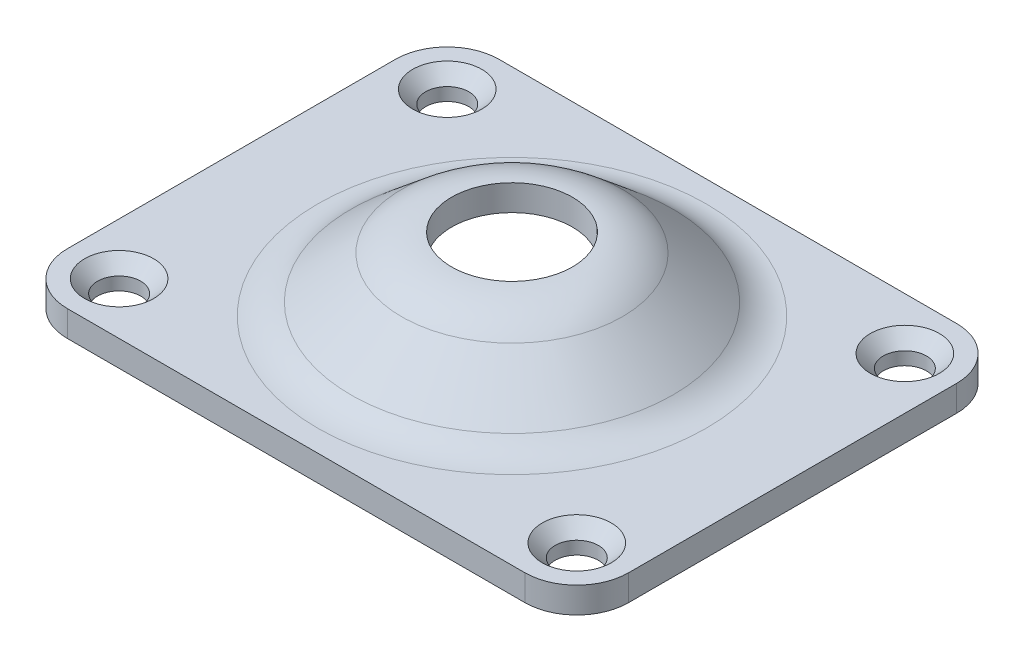
ISO-10303-21;
HEADER;
FILE_DESCRIPTION(('STEP AP214'),'2;1');
FILE_NAME('part.step','',(''),(''),'','','');
FILE_SCHEMA(('AUTOMOTIVE_DESIGN { 1 0 10303 214 1 1 1 1 }'));
ENDSEC;
DATA;
#1=APPLICATION_CONTEXT('core data for automotive mechanical design processes');
#2=APPLICATION_PROTOCOL_DEFINITION('international standard','automotive_design',2000,#1);
#3=PRODUCT_CONTEXT('',#1,'mechanical');
#4=PRODUCT('Part','Part','',(#3));
#5=PRODUCT_RELATED_PRODUCT_CATEGORY('part','',(#4));
#6=PRODUCT_DEFINITION_FORMATION('','',#4);
#7=PRODUCT_DEFINITION_CONTEXT('part definition',#1,'design');
#8=PRODUCT_DEFINITION('design','',#6,#7);
#9=PRODUCT_DEFINITION_SHAPE('','',#8);
#10=(LENGTH_UNIT() NAMED_UNIT(*) SI_UNIT(.MILLI.,.METRE.));
#11=(NAMED_UNIT(*) PLANE_ANGLE_UNIT() SI_UNIT($,.RADIAN.));
#12=(NAMED_UNIT(*) SI_UNIT($,.STERADIAN.) SOLID_ANGLE_UNIT());
#13=UNCERTAINTY_MEASURE_WITH_UNIT(LENGTH_MEASURE(1.E-05),#10,'distance_accuracy_value','');
#14=(GEOMETRIC_REPRESENTATION_CONTEXT(3) GLOBAL_UNCERTAINTY_ASSIGNED_CONTEXT((#13)) GLOBAL_UNIT_ASSIGNED_CONTEXT((#10,
#11,#12)) REPRESENTATION_CONTEXT('',''));
#15=CARTESIAN_POINT('',(0.,0.,0.));
#16=DIRECTION('',(0.,0.,1.));
#17=DIRECTION('',(1.,0.,0.));
#18=AXIS2_PLACEMENT_3D('',#15,#16,#17);
#19=CARTESIAN_POINT('',(-26.5,3.,19.));
#20=DIRECTION('',(0.,-1.,0.));
#21=DIRECTION('',(0.,0.,-1.));
#22=AXIS2_PLACEMENT_3D('',#19,#20,#21);
#23=PLANE('',#22);
#24=CARTESIAN_POINT('',(26.5,3.,19.));
#25=DIRECTION('',(0.,-1.,0.));
#26=DIRECTION('',(0.,0.,-1.));
#27=AXIS2_PLACEMENT_3D('',#24,#25,#26);
#28=CIRCLE('',#27,3.99999999999999);
#29=CARTESIAN_POINT('',(26.5,3.,23.));
#30=VERTEX_POINT('',#29);
#31=EDGE_CURVE('E184',#30,#30,#28,.T.);
#32=ORIENTED_EDGE('',*,*,#31,.T.);
#33=EDGE_LOOP('',(#32));
#34=FACE_BOUND('',#33,.T.);
#35=CARTESIAN_POINT('',(26.5,3.,-19.));
#36=DIRECTION('',(0.,-1.,0.));
#37=DIRECTION('',(0.,0.,-1.));
#38=AXIS2_PLACEMENT_3D('',#35,#36,#37);
#39=CIRCLE('',#38,3.99999999999999);
#40=CARTESIAN_POINT('',(26.5,3.,-15.));
#41=VERTEX_POINT('',#40);
#42=EDGE_CURVE('E181',#41,#41,#39,.T.);
#43=ORIENTED_EDGE('',*,*,#42,.T.);
#44=EDGE_LOOP('',(#43));
#45=FACE_BOUND('',#44,.T.);
#46=CARTESIAN_POINT('',(-26.5,3.,-19.));
#47=DIRECTION('',(0.,-1.,0.));
#48=DIRECTION('',(0.,0.,-1.));
#49=AXIS2_PLACEMENT_3D('',#46,#47,#48);
#50=CIRCLE('',#49,3.99999999999999);
#51=CARTESIAN_POINT('',(-26.5,3.,-15.));
#52=VERTEX_POINT('',#51);
#53=EDGE_CURVE('E178',#52,#52,#50,.T.);
#54=ORIENTED_EDGE('',*,*,#53,.T.);
#55=EDGE_LOOP('',(#54));
#56=FACE_BOUND('',#55,.T.);
#57=CARTESIAN_POINT('',(-26.5,3.,19.));
#58=DIRECTION('',(0.,-1.,0.));
#59=DIRECTION('',(0.,0.,-1.));
#60=AXIS2_PLACEMENT_3D('',#57,#58,#59);
#61=CIRCLE('',#60,3.99999999999999);
#62=CARTESIAN_POINT('',(-26.5,3.,23.));
#63=VERTEX_POINT('',#62);
#64=EDGE_CURVE('E175',#63,#63,#61,.T.);
#65=ORIENTED_EDGE('',*,*,#64,.T.);
#66=EDGE_LOOP('',(#65));
#67=FACE_BOUND('',#66,.T.);
#68=CARTESIAN_POINT('',(-26.5,3.,19.));
#69=DIRECTION('',(0.,1.,0.));
#70=DIRECTION('',(0.,0.,-1.));
#71=AXIS2_PLACEMENT_3D('',#68,#69,#70);
#72=CIRCLE('',#71,6.);
#73=CARTESIAN_POINT('',(-32.5,3.,19.));
#74=VERTEX_POINT('',#73);
#75=CARTESIAN_POINT('',(-26.5,3.,25.));
#76=VERTEX_POINT('',#75);
#77=EDGE_CURVE('E157',#74,#76,#72,.T.);
#78=ORIENTED_EDGE('',*,*,#77,.T.);
#79=DIRECTION('',(1.,0.,0.));
#80=VECTOR('',#79,1.);
#81=CARTESIAN_POINT('',(-26.5,3.,25.));
#82=LINE('',#81,#80);
#83=CARTESIAN_POINT('',(26.5,3.,25.));
#84=VERTEX_POINT('',#83);
#85=EDGE_CURVE('E105',#76,#84,#82,.T.);
#86=ORIENTED_EDGE('',*,*,#85,.T.);
#87=CARTESIAN_POINT('',(26.5,3.,19.));
#88=DIRECTION('',(0.,1.,0.));
#89=DIRECTION('',(0.,0.,1.));
#90=AXIS2_PLACEMENT_3D('',#87,#88,#89);
#91=CIRCLE('',#90,6.);
#92=CARTESIAN_POINT('',(32.5,3.,19.));
#93=VERTEX_POINT('',#92);
#94=EDGE_CURVE('E297',#84,#93,#91,.T.);
#95=ORIENTED_EDGE('',*,*,#94,.T.);
#96=DIRECTION('',(0.,0.,-1.));
#97=VECTOR('',#96,1.);
#98=CARTESIAN_POINT('',(32.5,3.,19.));
#99=LINE('',#98,#97);
#100=CARTESIAN_POINT('',(32.5,3.,-19.));
#101=VERTEX_POINT('',#100);
#102=EDGE_CURVE('E299',#93,#101,#99,.T.);
#103=ORIENTED_EDGE('',*,*,#102,.T.);
#104=CARTESIAN_POINT('',(26.5,3.,-19.));
#105=DIRECTION('',(0.,1.,0.));
#106=DIRECTION('',(0.,0.,-1.));
#107=AXIS2_PLACEMENT_3D('',#104,#105,#106);
#108=CIRCLE('',#107,6.);
#109=CARTESIAN_POINT('',(26.5,3.,-25.));
#110=VERTEX_POINT('',#109);
#111=EDGE_CURVE('E124',#101,#110,#108,.T.);
#112=ORIENTED_EDGE('',*,*,#111,.T.);
#113=DIRECTION('',(-1.,0.,0.));
#114=VECTOR('',#113,1.);
#115=CARTESIAN_POINT('',(-26.5,3.,-25.));
#116=LINE('',#115,#114);
#117=CARTESIAN_POINT('',(-26.5,3.,-25.));
#118=VERTEX_POINT('',#117);
#119=EDGE_CURVE('E118',#110,#118,#116,.T.);
#120=ORIENTED_EDGE('',*,*,#119,.T.);
#121=CARTESIAN_POINT('',(-26.5,3.,-19.));
#122=DIRECTION('',(0.,1.,0.));
#123=DIRECTION('',(0.,0.,-1.));
#124=AXIS2_PLACEMENT_3D('',#121,#122,#123);
#125=CIRCLE('',#124,6.);
#126=CARTESIAN_POINT('',(-32.5,3.,-19.));
#127=VERTEX_POINT('',#126);
#128=EDGE_CURVE('E122',#118,#127,#125,.T.);
#129=ORIENTED_EDGE('',*,*,#128,.T.);
#130=DIRECTION('',(0.,0.,1.));
#131=VECTOR('',#130,1.);
#132=CARTESIAN_POINT('',(-32.5,3.,19.));
#133=LINE('',#132,#131);
#134=EDGE_CURVE('E61',#127,#74,#133,.T.);
#135=ORIENTED_EDGE('',*,*,#134,.T.);
#136=EDGE_LOOP('',(#78,#86,#95,#103,#112,#120,#129,#135));
#137=FACE_BOUND('',#136,.T.);
#138=CARTESIAN_POINT('',(0.,3.,0.));
#139=DIRECTION('',(0.,1.,0.));
#140=DIRECTION('',(0.,0.,1.));
#141=AXIS2_PLACEMENT_3D('',#138,#139,#140);
#142=CIRCLE('',#141,22.5);
#143=CARTESIAN_POINT('',(0.,3.,22.5));
#144=VERTEX_POINT('',#143);
#145=EDGE_CURVE('E289',#144,#144,#142,.T.);
#146=ORIENTED_EDGE('',*,*,#145,.F.);
#147=EDGE_LOOP('',(#146));
#148=FACE_BOUND('',#147,.T.);
#149=ADVANCED_FACE('F43',(#34,#45,#56,#67,#137,#148),#23,.F.);
#150=CARTESIAN_POINT('',(-26.5,0.,19.));
#151=DIRECTION('',(0.,-1.,0.));
#152=DIRECTION('',(0.,0.,-1.));
#153=AXIS2_PLACEMENT_3D('',#150,#151,#152);
#154=PLANE('',#153);
#155=CARTESIAN_POINT('',(-26.5,0.,19.));
#156=DIRECTION('',(0.,1.,0.));
#157=DIRECTION('',(0.,0.,1.));
#158=AXIS2_PLACEMENT_3D('',#155,#156,#157);
#159=CIRCLE('',#158,2.5);
#160=CARTESIAN_POINT('',(-26.5,0.,21.5));
#161=VERTEX_POINT('',#160);
#162=EDGE_CURVE('E284',#161,#161,#159,.T.);
#163=ORIENTED_EDGE('',*,*,#162,.T.);
#164=EDGE_LOOP('',(#163));
#165=FACE_BOUND('',#164,.T.);
#166=CARTESIAN_POINT('',(26.5,0.,-19.));
#167=DIRECTION('',(0.,1.,0.));
#168=DIRECTION('',(0.,0.,1.));
#169=AXIS2_PLACEMENT_3D('',#166,#167,#168);
#170=CIRCLE('',#169,2.5);
#171=CARTESIAN_POINT('',(26.5,0.,-16.5));
#172=VERTEX_POINT('',#171);
#173=EDGE_CURVE('E283',#172,#172,#170,.T.);
#174=ORIENTED_EDGE('',*,*,#173,.T.);
#175=EDGE_LOOP('',(#174));
#176=FACE_BOUND('',#175,.T.);
#177=CARTESIAN_POINT('',(-26.5,0.,19.));
#178=DIRECTION('',(0.,1.,0.));
#179=DIRECTION('',(0.,0.,-1.));
#180=AXIS2_PLACEMENT_3D('',#177,#178,#179);
#181=CIRCLE('',#180,6.);
#182=CARTESIAN_POINT('',(-32.5,0.,19.));
#183=VERTEX_POINT('',#182);
#184=CARTESIAN_POINT('',(-26.5,0.,25.));
#185=VERTEX_POINT('',#184);
#186=EDGE_CURVE('E142',#183,#185,#181,.T.);
#187=ORIENTED_EDGE('',*,*,#186,.F.);
#188=DIRECTION('',(0.,0.,1.));
#189=VECTOR('',#188,1.);
#190=CARTESIAN_POINT('',(-32.5,0.,19.));
#191=LINE('',#190,#189);
#192=CARTESIAN_POINT('',(-32.5,0.,-19.));
#193=VERTEX_POINT('',#192);
#194=EDGE_CURVE('E96',#193,#183,#191,.T.);
#195=ORIENTED_EDGE('',*,*,#194,.F.);
#196=CARTESIAN_POINT('',(-26.5,0.,-19.));
#197=DIRECTION('',(0.,1.,0.));
#198=DIRECTION('',(0.,0.,-1.));
#199=AXIS2_PLACEMENT_3D('',#196,#197,#198);
#200=CIRCLE('',#199,6.);
#201=CARTESIAN_POINT('',(-26.5,0.,-25.));
#202=VERTEX_POINT('',#201);
#203=EDGE_CURVE('E90',#202,#193,#200,.T.);
#204=ORIENTED_EDGE('',*,*,#203,.F.);
#205=DIRECTION('',(-1.,0.,0.));
#206=VECTOR('',#205,1.);
#207=CARTESIAN_POINT('',(-26.5,0.,-25.));
#208=LINE('',#207,#206);
#209=CARTESIAN_POINT('',(26.5,0.,-25.));
#210=VERTEX_POINT('',#209);
#211=EDGE_CURVE('E132',#210,#202,#208,.T.);
#212=ORIENTED_EDGE('',*,*,#211,.F.);
#213=CARTESIAN_POINT('',(26.5,0.,-19.));
#214=DIRECTION('',(0.,1.,0.));
#215=DIRECTION('',(0.,0.,-1.));
#216=AXIS2_PLACEMENT_3D('',#213,#214,#215);
#217=CIRCLE('',#216,6.);
#218=CARTESIAN_POINT('',(32.5,0.,-19.));
#219=VERTEX_POINT('',#218);
#220=EDGE_CURVE('E152',#219,#210,#217,.T.);
#221=ORIENTED_EDGE('',*,*,#220,.F.);
#222=DIRECTION('',(0.,0.,-1.));
#223=VECTOR('',#222,1.);
#224=CARTESIAN_POINT('',(32.5,0.,19.));
#225=LINE('',#224,#223);
#226=CARTESIAN_POINT('',(32.5,0.,19.));
#227=VERTEX_POINT('',#226);
#228=EDGE_CURVE('E150',#227,#219,#225,.T.);
#229=ORIENTED_EDGE('',*,*,#228,.F.);
#230=CARTESIAN_POINT('',(26.5,0.,19.));
#231=DIRECTION('',(0.,1.,0.));
#232=DIRECTION('',(0.,0.,1.));
#233=AXIS2_PLACEMENT_3D('',#230,#231,#232);
#234=CIRCLE('',#233,6.);
#235=CARTESIAN_POINT('',(26.5,0.,25.));
#236=VERTEX_POINT('',#235);
#237=EDGE_CURVE('E148',#236,#227,#234,.T.);
#238=ORIENTED_EDGE('',*,*,#237,.F.);
#239=DIRECTION('',(1.,0.,0.));
#240=VECTOR('',#239,1.);
#241=CARTESIAN_POINT('',(-26.5,0.,25.));
#242=LINE('',#241,#240);
#243=EDGE_CURVE('E145',#185,#236,#242,.T.);
#244=ORIENTED_EDGE('',*,*,#243,.F.);
#245=EDGE_LOOP('',(#187,#195,#204,#212,#221,#229,#238,#244));
#246=FACE_BOUND('',#245,.T.);
#247=CARTESIAN_POINT('',(-26.5,0.,-19.));
#248=DIRECTION('',(0.,1.,0.));
#249=DIRECTION('',(0.,0.,1.));
#250=AXIS2_PLACEMENT_3D('',#247,#248,#249);
#251=CIRCLE('',#250,2.5);
#252=CARTESIAN_POINT('',(-26.5,0.,-16.5));
#253=VERTEX_POINT('',#252);
#254=EDGE_CURVE('E146',#253,#253,#251,.T.);
#255=ORIENTED_EDGE('',*,*,#254,.T.);
#256=EDGE_LOOP('',(#255));
#257=FACE_BOUND('',#256,.T.);
#258=CARTESIAN_POINT('',(26.5,0.,19.));
#259=DIRECTION('',(0.,1.,0.));
#260=DIRECTION('',(0.,0.,1.));
#261=AXIS2_PLACEMENT_3D('',#258,#259,#260);
#262=CIRCLE('',#261,2.5);
#263=CARTESIAN_POINT('',(26.5,0.,21.5));
#264=VERTEX_POINT('',#263);
#265=EDGE_CURVE('E281',#264,#264,#262,.T.);
#266=ORIENTED_EDGE('',*,*,#265,.T.);
#267=EDGE_LOOP('',(#266));
#268=FACE_BOUND('',#267,.T.);
#269=CARTESIAN_POINT('',(0.,0.,0.));
#270=DIRECTION('',(0.,-1.,0.));
#271=DIRECTION('',(1.,0.,0.));
#272=AXIS2_PLACEMENT_3D('',#269,#270,#271);
#273=CIRCLE('',#272,22.5);
#274=CARTESIAN_POINT('',(22.5,0.,0.));
#275=VERTEX_POINT('',#274);
#276=EDGE_CURVE('E316',#275,#275,#273,.T.);
#277=ORIENTED_EDGE('',*,*,#276,.F.);
#278=EDGE_LOOP('',(#277));
#279=FACE_BOUND('',#278,.T.);
#280=ADVANCED_FACE('F210',(#165,#176,#246,#257,#268,#279),#154,.T.);
#281=CARTESIAN_POINT('',(-26.5,3.,19.));
#282=DIRECTION('',(0.,-1.,0.));
#283=DIRECTION('',(0.,0.,-1.));
#284=AXIS2_PLACEMENT_3D('',#281,#282,#283);
#285=CYLINDRICAL_SURFACE('',#284,6.);
#286=ORIENTED_EDGE('',*,*,#186,.T.);
#287=DIRECTION('',(0.,-1.,0.));
#288=VECTOR('',#287,1.);
#289=CARTESIAN_POINT('',(-26.5,3.,25.));
#290=LINE('',#289,#288);
#291=EDGE_CURVE('E170',#76,#185,#290,.T.);
#292=ORIENTED_EDGE('',*,*,#291,.F.);
#293=ORIENTED_EDGE('',*,*,#77,.F.);
#294=DIRECTION('',(0.,-1.,0.));
#295=VECTOR('',#294,1.);
#296=CARTESIAN_POINT('',(-32.5,3.,19.));
#297=LINE('',#296,#295);
#298=EDGE_CURVE('E138',#74,#183,#297,.T.);
#299=ORIENTED_EDGE('',*,*,#298,.T.);
#300=EDGE_LOOP('',(#286,#292,#293,#299));
#301=FACE_BOUND('',#300,.T.);
#302=ADVANCED_FACE('F218',(#301),#285,.T.);
#303=CARTESIAN_POINT('',(-26.5,3.,25.));
#304=DIRECTION('',(0.,0.,-1.));
#305=DIRECTION('',(-1.,0.,0.));
#306=AXIS2_PLACEMENT_3D('',#303,#304,#305);
#307=PLANE('',#306);
#308=ORIENTED_EDGE('',*,*,#243,.T.);
#309=DIRECTION('',(0.,-1.,0.));
#310=VECTOR('',#309,1.);
#311=CARTESIAN_POINT('',(26.5,3.,25.));
#312=LINE('',#311,#310);
#313=EDGE_CURVE('E167',#84,#236,#312,.T.);
#314=ORIENTED_EDGE('',*,*,#313,.F.);
#315=ORIENTED_EDGE('',*,*,#85,.F.);
#316=ORIENTED_EDGE('',*,*,#291,.T.);
#317=EDGE_LOOP('',(#308,#314,#315,#316));
#318=FACE_BOUND('',#317,.T.);
#319=ADVANCED_FACE('F243',(#318),#307,.F.);
#320=CARTESIAN_POINT('',(26.5,3.,19.));
#321=DIRECTION('',(0.,-1.,0.));
#322=DIRECTION('',(0.,0.,-1.));
#323=AXIS2_PLACEMENT_3D('',#320,#321,#322);
#324=CYLINDRICAL_SURFACE('',#323,6.);
#325=ORIENTED_EDGE('',*,*,#237,.T.);
#326=DIRECTION('',(0.,-1.,0.));
#327=VECTOR('',#326,1.);
#328=CARTESIAN_POINT('',(32.5,3.,19.));
#329=LINE('',#328,#327);
#330=EDGE_CURVE('E164',#93,#227,#329,.T.);
#331=ORIENTED_EDGE('',*,*,#330,.F.);
#332=ORIENTED_EDGE('',*,*,#94,.F.);
#333=ORIENTED_EDGE('',*,*,#313,.T.);
#334=EDGE_LOOP('',(#325,#331,#332,#333));
#335=FACE_BOUND('',#334,.T.);
#336=ADVANCED_FACE('F239',(#335),#324,.T.);
#337=CARTESIAN_POINT('',(32.5,3.,19.));
#338=DIRECTION('',(-1.,0.,0.));
#339=DIRECTION('',(0.,0.,1.));
#340=AXIS2_PLACEMENT_3D('',#337,#338,#339);
#341=PLANE('',#340);
#342=ORIENTED_EDGE('',*,*,#228,.T.);
#343=DIRECTION('',(0.,-1.,0.));
#344=VECTOR('',#343,1.);
#345=CARTESIAN_POINT('',(32.5,3.,-19.));
#346=LINE('',#345,#344);
#347=EDGE_CURVE('E161',#101,#219,#346,.T.);
#348=ORIENTED_EDGE('',*,*,#347,.F.);
#349=ORIENTED_EDGE('',*,*,#102,.F.);
#350=ORIENTED_EDGE('',*,*,#330,.T.);
#351=EDGE_LOOP('',(#342,#348,#349,#350));
#352=FACE_BOUND('',#351,.T.);
#353=ADVANCED_FACE('F235',(#352),#341,.F.);
#354=CARTESIAN_POINT('',(26.5,3.,-19.));
#355=DIRECTION('',(0.,-1.,0.));
#356=DIRECTION('',(0.,0.,-1.));
#357=AXIS2_PLACEMENT_3D('',#354,#355,#356);
#358=CYLINDRICAL_SURFACE('',#357,6.);
#359=ORIENTED_EDGE('',*,*,#220,.T.);
#360=DIRECTION('',(0.,-1.,0.));
#361=VECTOR('',#360,1.);
#362=CARTESIAN_POINT('',(26.5,3.,-25.));
#363=LINE('',#362,#361);
#364=EDGE_CURVE('E133',#110,#210,#363,.T.);
#365=ORIENTED_EDGE('',*,*,#364,.F.);
#366=ORIENTED_EDGE('',*,*,#111,.F.);
#367=ORIENTED_EDGE('',*,*,#347,.T.);
#368=EDGE_LOOP('',(#359,#365,#366,#367));
#369=FACE_BOUND('',#368,.T.);
#370=ADVANCED_FACE('F232',(#369),#358,.T.);
#371=CARTESIAN_POINT('',(-26.5,3.,-25.));
#372=DIRECTION('',(0.,0.,1.));
#373=DIRECTION('',(1.,0.,0.));
#374=AXIS2_PLACEMENT_3D('',#371,#372,#373);
#375=PLANE('',#374);
#376=ORIENTED_EDGE('',*,*,#211,.T.);
#377=DIRECTION('',(0.,-1.,0.));
#378=VECTOR('',#377,1.);
#379=CARTESIAN_POINT('',(-26.5,3.,-25.));
#380=LINE('',#379,#378);
#381=EDGE_CURVE('E129',#118,#202,#380,.T.);
#382=ORIENTED_EDGE('',*,*,#381,.F.);
#383=ORIENTED_EDGE('',*,*,#119,.F.);
#384=ORIENTED_EDGE('',*,*,#364,.T.);
#385=EDGE_LOOP('',(#376,#382,#383,#384));
#386=FACE_BOUND('',#385,.T.);
#387=ADVANCED_FACE('F130',(#386),#375,.F.);
#388=CARTESIAN_POINT('',(-26.5,3.,-19.));
#389=DIRECTION('',(0.,-1.,0.));
#390=DIRECTION('',(0.,0.,-1.));
#391=AXIS2_PLACEMENT_3D('',#388,#389,#390);
#392=CYLINDRICAL_SURFACE('',#391,6.);
#393=ORIENTED_EDGE('',*,*,#203,.T.);
#394=DIRECTION('',(0.,-1.,0.));
#395=VECTOR('',#394,1.);
#396=CARTESIAN_POINT('',(-32.5,3.,-19.));
#397=LINE('',#396,#395);
#398=EDGE_CURVE('E134',#127,#193,#397,.T.);
#399=ORIENTED_EDGE('',*,*,#398,.F.);
#400=ORIENTED_EDGE('',*,*,#128,.F.);
#401=ORIENTED_EDGE('',*,*,#381,.T.);
#402=EDGE_LOOP('',(#393,#399,#400,#401));
#403=FACE_BOUND('',#402,.T.);
#404=ADVANCED_FACE('F136',(#403),#392,.T.);
#405=CARTESIAN_POINT('',(-32.5,3.,19.));
#406=DIRECTION('',(1.,0.,0.));
#407=DIRECTION('',(0.,0.,-1.));
#408=AXIS2_PLACEMENT_3D('',#405,#406,#407);
#409=PLANE('',#408);
#410=ORIENTED_EDGE('',*,*,#194,.T.);
#411=ORIENTED_EDGE('',*,*,#298,.F.);
#412=ORIENTED_EDGE('',*,*,#134,.F.);
#413=ORIENTED_EDGE('',*,*,#398,.T.);
#414=EDGE_LOOP('',(#410,#411,#412,#413));
#415=FACE_BOUND('',#414,.T.);
#416=ADVANCED_FACE('F225',(#415),#409,.F.);
#417=CARTESIAN_POINT('',(-26.5,3.,-19.));
#418=DIRECTION('',(0.,-1.,0.));
#419=DIRECTION('',(0.,0.,-1.));
#420=AXIS2_PLACEMENT_3D('',#417,#418,#419);
#421=CYLINDRICAL_SURFACE('',#420,2.5);
#422=CARTESIAN_POINT('',(-26.5,1.50000000000001,-19.));
#423=DIRECTION('',(0.,-1.,0.));
#424=DIRECTION('',(0.,0.,-1.));
#425=AXIS2_PLACEMENT_3D('',#422,#423,#424);
#426=CIRCLE('',#425,2.5);
#427=CARTESIAN_POINT('',(-26.5,1.50000000000001,-16.5));
#428=VERTEX_POINT('',#427);
#429=EDGE_CURVE('E53',#428,#428,#426,.F.);
#430=ORIENTED_EDGE('',*,*,#429,.T.);
#431=EDGE_LOOP('',(#430));
#432=FACE_BOUND('',#431,.T.);
#433=ORIENTED_EDGE('',*,*,#254,.F.);
#434=EDGE_LOOP('',(#433));
#435=FACE_BOUND('',#434,.T.);
#436=ADVANCED_FACE('F192',(#432,#435),#421,.F.);
#437=CARTESIAN_POINT('',(26.5,3.,-19.));
#438=DIRECTION('',(0.,-1.,0.));
#439=DIRECTION('',(0.,0.,-1.));
#440=AXIS2_PLACEMENT_3D('',#437,#438,#439);
#441=CYLINDRICAL_SURFACE('',#440,2.5);
#442=CARTESIAN_POINT('',(26.5,1.50000000000001,-19.));
#443=DIRECTION('',(0.,-1.,0.));
#444=DIRECTION('',(0.,0.,-1.));
#445=AXIS2_PLACEMENT_3D('',#442,#443,#444);
#446=CIRCLE('',#445,2.5);
#447=CARTESIAN_POINT('',(26.5,1.50000000000001,-16.5));
#448=VERTEX_POINT('',#447);
#449=EDGE_CURVE('E187',#448,#448,#446,.F.);
#450=ORIENTED_EDGE('',*,*,#449,.T.);
#451=EDGE_LOOP('',(#450));
#452=FACE_BOUND('',#451,.T.);
#453=ORIENTED_EDGE('',*,*,#173,.F.);
#454=EDGE_LOOP('',(#453));
#455=FACE_BOUND('',#454,.T.);
#456=ADVANCED_FACE('F277',(#452,#455),#441,.F.);
#457=CARTESIAN_POINT('',(26.5,3.,19.));
#458=DIRECTION('',(0.,-1.,0.));
#459=DIRECTION('',(0.,0.,-1.));
#460=AXIS2_PLACEMENT_3D('',#457,#458,#459);
#461=CYLINDRICAL_SURFACE('',#460,2.5);
#462=CARTESIAN_POINT('',(26.5,1.50000000000001,19.));
#463=DIRECTION('',(0.,-1.,0.));
#464=DIRECTION('',(0.,0.,-1.));
#465=AXIS2_PLACEMENT_3D('',#462,#463,#464);
#466=CIRCLE('',#465,2.5);
#467=CARTESIAN_POINT('',(26.5,1.50000000000001,21.5));
#468=VERTEX_POINT('',#467);
#469=EDGE_CURVE('E172',#468,#468,#466,.F.);
#470=ORIENTED_EDGE('',*,*,#469,.T.);
#471=EDGE_LOOP('',(#470));
#472=FACE_BOUND('',#471,.T.);
#473=ORIENTED_EDGE('',*,*,#265,.F.);
#474=EDGE_LOOP('',(#473));
#475=FACE_BOUND('',#474,.T.);
#476=ADVANCED_FACE('F273',(#472,#475),#461,.F.);
#477=CARTESIAN_POINT('',(-26.5,3.,19.));
#478=DIRECTION('',(0.,-1.,0.));
#479=DIRECTION('',(0.,0.,-1.));
#480=AXIS2_PLACEMENT_3D('',#477,#478,#479);
#481=CYLINDRICAL_SURFACE('',#480,2.5);
#482=CARTESIAN_POINT('',(-26.5,1.50000000000001,19.));
#483=DIRECTION('',(0.,-1.,0.));
#484=DIRECTION('',(0.,0.,-1.));
#485=AXIS2_PLACEMENT_3D('',#482,#483,#484);
#486=CIRCLE('',#485,2.5);
#487=CARTESIAN_POINT('',(-26.5,1.50000000000001,21.5));
#488=VERTEX_POINT('',#487);
#489=EDGE_CURVE('E11',#488,#488,#486,.F.);
#490=ORIENTED_EDGE('',*,*,#489,.T.);
#491=EDGE_LOOP('',(#490));
#492=FACE_BOUND('',#491,.T.);
#493=ORIENTED_EDGE('',*,*,#162,.F.);
#494=EDGE_LOOP('',(#493));
#495=FACE_BOUND('',#494,.T.);
#496=ADVANCED_FACE('F276',(#492,#495),#481,.F.);
#497=CARTESIAN_POINT('',(0.,8.99999999999997,0.));
#498=DIRECTION('',(0.,-1.,0.));
#499=DIRECTION('',(1.,0.,0.));
#500=AXIS2_PLACEMENT_3D('',#497,#498,#499);
#501=TOROIDAL_SURFACE('',#500,22.5,6.);
#502=ORIENTED_EDGE('',*,*,#145,.T.);
#503=EDGE_LOOP('',(#502));
#504=FACE_BOUND('',#503,.T.);
#505=CARTESIAN_POINT('',(0.,4.4037333412861,0.));
#506=DIRECTION('',(0.,-1.,0.));
#507=DIRECTION('',(1.,0.,0.));
#508=AXIS2_PLACEMENT_3D('',#505,#506,#507);
#509=CIRCLE('',#508,18.6432743418808);
#510=CARTESIAN_POINT('',(18.6432743418808,4.40373334128608,0.));
#511=VERTEX_POINT('',#510);
#512=EDGE_CURVE('E336',#511,#511,#509,.T.);
#513=ORIENTED_EDGE('',*,*,#512,.T.);
#514=EDGE_LOOP('',(#513));
#515=FACE_BOUND('',#514,.T.);
#516=ADVANCED_FACE('F340',(#504,#515),#501,.F.);
#517=CARTESIAN_POINT('',(0.,8.99999999999997,0.));
#518=DIRECTION('',(0.,-1.,0.));
#519=DIRECTION('',(1.,0.,0.));
#520=AXIS2_PLACEMENT_3D('',#517,#518,#519);
#521=TOROIDAL_SURFACE('',#520,22.5,9.);
#522=CARTESIAN_POINT('',(0.,2.10560001192916,0.));
#523=DIRECTION('',(0.,-1.,0.));
#524=DIRECTION('',(1.,0.,0.));
#525=AXIS2_PLACEMENT_3D('',#522,#523,#524);
#526=CIRCLE('',#525,16.7149115128211);
#527=CARTESIAN_POINT('',(16.7149115128211,2.10560001192914,0.));
#528=VERTEX_POINT('',#527);
#529=EDGE_CURVE('E318',#528,#528,#526,.T.);
#530=ORIENTED_EDGE('',*,*,#529,.F.);
#531=EDGE_LOOP('',(#530));
#532=FACE_BOUND('',#531,.T.);
#533=ORIENTED_EDGE('',*,*,#276,.T.);
#534=EDGE_LOOP('',(#533));
#535=FACE_BOUND('',#534,.T.);
#536=ADVANCED_FACE('F364',(#532,#535),#521,.T.);
#537=CARTESIAN_POINT('',(0.,2.10560001192916,0.));
#538=DIRECTION('',(0.,-1.,0.));
#539=DIRECTION('',(1.,0.,0.));
#540=AXIS2_PLACEMENT_3D('',#537,#538,#539);
#541=CONICAL_SURFACE('',#540,16.7149115128211,0.872664625997166);
#542=CARTESIAN_POINT('',(0.,7.0212016019775,0.));
#543=DIRECTION('',(0.,-1.,0.));
#544=DIRECTION('',(1.,0.,0.));
#545=AXIS2_PLACEMENT_3D('',#542,#543,#544);
#546=CIRCLE('',#545,10.8567256581192);
#547=CARTESIAN_POINT('',(10.8567256581192,7.02120160197749,0.));
#548=VERTEX_POINT('',#547);
#549=EDGE_CURVE('E322',#548,#548,#546,.T.);
#550=ORIENTED_EDGE('',*,*,#549,.F.);
#551=EDGE_LOOP('',(#550));
#552=FACE_BOUND('',#551,.T.);
#553=ORIENTED_EDGE('',*,*,#529,.T.);
#554=EDGE_LOOP('',(#553));
#555=FACE_BOUND('',#554,.T.);
#556=ADVANCED_FACE('F358',(#552,#555),#541,.F.);
#557=CARTESIAN_POINT('',(0.,2.42493494326363,0.));
#558=DIRECTION('',(0.,-1.,0.));
#559=DIRECTION('',(1.,0.,0.));
#560=AXIS2_PLACEMENT_3D('',#557,#558,#559);
#561=TOROIDAL_SURFACE('',#560,6.99999999999999,6.);
#562=CARTESIAN_POINT('',(0.,8.42493494326363,0.));
#563=DIRECTION('',(0.,-1.,0.));
#564=DIRECTION('',(1.,0.,0.));
#565=AXIS2_PLACEMENT_3D('',#562,#563,#564);
#566=CIRCLE('',#565,7.);
#567=CARTESIAN_POINT('',(6.99999999999999,8.42493494326362,0.));
#568=VERTEX_POINT('',#567);
#569=EDGE_CURVE('E327',#568,#568,#566,.T.);
#570=ORIENTED_EDGE('',*,*,#569,.F.);
#571=EDGE_LOOP('',(#570));
#572=FACE_BOUND('',#571,.T.);
#573=ORIENTED_EDGE('',*,*,#549,.T.);
#574=EDGE_LOOP('',(#573));
#575=FACE_BOUND('',#574,.T.);
#576=ADVANCED_FACE('F352',(#572,#575),#561,.F.);
#577=CARTESIAN_POINT('',(0.,3.,0.));
#578=DIRECTION('',(0.,-1.,0.));
#579=DIRECTION('',(1.,0.,0.));
#580=AXIS2_PLACEMENT_3D('',#577,#578,#579);
#581=CYLINDRICAL_SURFACE('',#580,7.);
#582=CARTESIAN_POINT('',(0.,11.4249349432636,0.));
#583=DIRECTION('',(0.,-1.,0.));
#584=DIRECTION('',(1.,0.,0.));
#585=AXIS2_PLACEMENT_3D('',#582,#583,#584);
#586=CIRCLE('',#585,7.);
#587=CARTESIAN_POINT('',(7.,11.4249349432636,0.));
#588=VERTEX_POINT('',#587);
#589=EDGE_CURVE('E330',#588,#588,#586,.T.);
#590=ORIENTED_EDGE('',*,*,#589,.F.);
#591=EDGE_LOOP('',(#590));
#592=FACE_BOUND('',#591,.T.);
#593=ORIENTED_EDGE('',*,*,#569,.T.);
#594=EDGE_LOOP('',(#593));
#595=FACE_BOUND('',#594,.T.);
#596=ADVANCED_FACE('F346',(#592,#595),#581,.F.);
#597=CARTESIAN_POINT('',(0.,2.42493494326363,0.));
#598=DIRECTION('',(0.,-1.,0.));
#599=DIRECTION('',(1.,0.,0.));
#600=AXIS2_PLACEMENT_3D('',#597,#598,#599);
#601=DEGENERATE_TOROIDAL_SURFACE('',#600,6.99999999999999,9.,.T.);
#602=CARTESIAN_POINT('',(0.,9.31933493133443,0.));
#603=DIRECTION('',(0.,-1.,0.));
#604=DIRECTION('',(1.,0.,0.));
#605=AXIS2_PLACEMENT_3D('',#602,#603,#604);
#606=CIRCLE('',#605,12.7850884871788);
#607=CARTESIAN_POINT('',(12.7850884871788,9.31933493133442,0.));
#608=VERTEX_POINT('',#607);
#609=EDGE_CURVE('E333',#608,#608,#606,.T.);
#610=ORIENTED_EDGE('',*,*,#609,.F.);
#611=EDGE_LOOP('',(#610));
#612=FACE_BOUND('',#611,.T.);
#613=ORIENTED_EDGE('',*,*,#589,.T.);
#614=EDGE_LOOP('',(#613));
#615=FACE_BOUND('',#614,.T.);
#616=ADVANCED_FACE('F266',(#612,#615),#601,.T.);
#617=CARTESIAN_POINT('',(0.,9.31933493133443,0.));
#618=DIRECTION('',(0.,-1.,0.));
#619=DIRECTION('',(1.,0.,0.));
#620=AXIS2_PLACEMENT_3D('',#617,#618,#619);
#621=CONICAL_SURFACE('',#620,12.7850884871788,0.872664625997166);
#622=ORIENTED_EDGE('',*,*,#512,.F.);
#623=EDGE_LOOP('',(#622));
#624=FACE_BOUND('',#623,.T.);
#625=ORIENTED_EDGE('',*,*,#609,.T.);
#626=EDGE_LOOP('',(#625));
#627=FACE_BOUND('',#626,.T.);
#628=ADVANCED_FACE('F255',(#624,#627),#621,.T.);
#629=CARTESIAN_POINT('',(26.5,1.50000000000001,19.));
#630=DIRECTION('',(0.,1.,0.));
#631=DIRECTION('',(0.,0.,1.));
#632=AXIS2_PLACEMENT_3D('',#629,#630,#631);
#633=CONICAL_SURFACE('',#632,2.5,0.785398163397448);
#634=CARTESIAN_POINT('',(26.5,3.,23.));
#635=CARTESIAN_POINT('',(26.5,2.984375,22.984375));
#636=CARTESIAN_POINT('',(26.5,2.96875,22.96875));
#637=CARTESIAN_POINT('',(26.5,2.9375,22.9375));
#638=CARTESIAN_POINT('',(26.5,2.921875,22.921875));
#639=CARTESIAN_POINT('',(26.5,2.890625,22.890625));
#640=CARTESIAN_POINT('',(26.5,2.875,22.875));
#641=CARTESIAN_POINT('',(26.5,2.84375,22.84375));
#642=CARTESIAN_POINT('',(26.5,2.828125,22.828125));
#643=CARTESIAN_POINT('',(26.5,2.796875,22.796875));
#644=CARTESIAN_POINT('',(26.5,2.78125,22.78125));
#645=CARTESIAN_POINT('',(26.5,2.75,22.75));
#646=CARTESIAN_POINT('',(26.5,2.734375,22.734375));
#647=CARTESIAN_POINT('',(26.5,2.703125,22.703125));
#648=CARTESIAN_POINT('',(26.5,2.6875,22.6875));
#649=CARTESIAN_POINT('',(26.5,2.65625,22.65625));
#650=CARTESIAN_POINT('',(26.5,2.640625,22.640625));
#651=CARTESIAN_POINT('',(26.5,2.609375,22.609375));
#652=CARTESIAN_POINT('',(26.5,2.59375,22.59375));
#653=CARTESIAN_POINT('',(26.5,2.5625,22.5625));
#654=CARTESIAN_POINT('',(26.5,2.546875,22.546875));
#655=CARTESIAN_POINT('',(26.5,2.515625,22.515625));
#656=CARTESIAN_POINT('',(26.5,2.5,22.5));
#657=CARTESIAN_POINT('',(26.5,2.46875,22.46875));
#658=CARTESIAN_POINT('',(26.5,2.453125,22.453125));
#659=CARTESIAN_POINT('',(26.5,2.421875,22.421875));
#660=CARTESIAN_POINT('',(26.5,2.40625,22.40625));
#661=CARTESIAN_POINT('',(26.5,2.375,22.375));
#662=CARTESIAN_POINT('',(26.5,2.359375,22.359375));
#663=CARTESIAN_POINT('',(26.5,2.328125,22.328125));
#664=CARTESIAN_POINT('',(26.5,2.3125,22.3125));
#665=CARTESIAN_POINT('',(26.5,2.28125,22.28125));
#666=CARTESIAN_POINT('',(26.5,2.265625,22.265625));
#667=CARTESIAN_POINT('',(26.5,2.234375,22.234375));
#668=CARTESIAN_POINT('',(26.5,2.21875,22.21875));
#669=CARTESIAN_POINT('',(26.5,2.1875,22.1875));
#670=CARTESIAN_POINT('',(26.5,2.171875,22.171875));
#671=CARTESIAN_POINT('',(26.5,2.140625,22.140625));
#672=CARTESIAN_POINT('',(26.5,2.125,22.125));
#673=CARTESIAN_POINT('',(26.5,2.09375,22.09375));
#674=CARTESIAN_POINT('',(26.5,2.078125,22.078125));
#675=CARTESIAN_POINT('',(26.5,2.046875,22.046875));
#676=CARTESIAN_POINT('',(26.5,2.03125,22.03125));
#677=CARTESIAN_POINT('',(26.5,2.00000000000001,22.));
#678=CARTESIAN_POINT('',(26.5,1.98437500000001,21.984375));
#679=CARTESIAN_POINT('',(26.5,1.95312500000001,21.953125));
#680=CARTESIAN_POINT('',(26.5,1.9375,21.9375));
#681=CARTESIAN_POINT('',(26.5,1.90625000000001,21.90625));
#682=CARTESIAN_POINT('',(26.5,1.89062500000001,21.890625));
#683=CARTESIAN_POINT('',(26.5,1.85937500000001,21.859375));
#684=CARTESIAN_POINT('',(26.5,1.84375000000001,21.84375));
#685=CARTESIAN_POINT('',(26.5,1.81250000000001,21.8125));
#686=CARTESIAN_POINT('',(26.5,1.79687500000001,21.796875));
#687=CARTESIAN_POINT('',(26.5,1.76562500000001,21.765625));
#688=CARTESIAN_POINT('',(26.5,1.75000000000001,21.75));
#689=CARTESIAN_POINT('',(26.5,1.71875000000001,21.71875));
#690=CARTESIAN_POINT('',(26.5,1.70312500000001,21.703125));
#691=CARTESIAN_POINT('',(26.5,1.67187500000001,21.671875));
#692=CARTESIAN_POINT('',(26.5,1.65625000000001,21.65625));
#693=CARTESIAN_POINT('',(26.5,1.62500000000001,21.625));
#694=CARTESIAN_POINT('',(26.5,1.60937500000001,21.609375));
#695=CARTESIAN_POINT('',(26.5,1.57812500000001,21.578125));
#696=CARTESIAN_POINT('',(26.5,1.56250000000001,21.5625));
#697=CARTESIAN_POINT('',(26.5,1.53125000000001,21.53125));
#698=CARTESIAN_POINT('',(26.5,1.51562500000001,21.515625));
#699=CARTESIAN_POINT('',(26.5,1.50000000000001,21.5));
#700=B_SPLINE_CURVE_WITH_KNOTS('',3,(#634,#635,#636,#637,#638,#639,#640,#641,#642,#643,#644,
#645,#646,#647,#648,#649,#650,#651,#652,#653,#654,#655,#656,#657,#658,#659,#660,#661,#662,#663,
#664,#665,#666,#667,#668,#669,#670,#671,#672,#673,#674,#675,#676,#677,#678,#679,#680,#681,#682,
#683,#684,#685,#686,#687,#688,#689,#690,#691,#692,#693,#694,#695,#696,#697,#698,#699),
.UNSPECIFIED.,.F.,.F.,(4,2,2,2,2,2,2,2,2,2,2,2,2,2,2,2,2,2,2,2,2,2,2,2,2,2,2,2,2,2,2,2,4),(0.,
0.0662912607362374,0.132582521472477,0.198873782208715,0.265165042944955,0.331456303681192,
0.39774756441743,0.46403882515367,0.530330085889907,0.596621346626144,0.662912607362385,
0.729203868098622,0.795495128834862,0.861786389571099,0.928077650307339,0.994368911043576,
1.06066017177981,1.12695143251605,1.19324269325229,1.25953395398853,1.32582521472477,
1.39211647546101,1.45840773619725,1.52469899693348,1.59099025766972,1.65728151840596,
1.7235727791422,1.78986403987844,1.85615530061468,1.92244656135092,1.98873782208715,
2.05502908282339,2.12132034355963),.UNSPECIFIED.);
#701=EDGE_CURVE('BSEAM204',#30,#468,#700,.T.);
#702=ORIENTED_EDGE('',*,*,#31,.F.);
#703=ORIENTED_EDGE('',*,*,#469,.F.);
#704=ORIENTED_EDGE('',*,*,#701,.T.);
#705=ORIENTED_EDGE('',*,*,#701,.F.);
#706=EDGE_LOOP('',(#702,#704,#703,#705));
#707=FACE_BOUND('',#706,.T.);
#708=ADVANCED_FACE('F204',(#707),#633,.F.);
#709=CARTESIAN_POINT('',(26.5,1.50000000000001,-19.));
#710=DIRECTION('',(0.,1.,0.));
#711=DIRECTION('',(0.,0.,1.));
#712=AXIS2_PLACEMENT_3D('',#709,#710,#711);
#713=CONICAL_SURFACE('',#712,2.5,0.785398163397448);
#714=CARTESIAN_POINT('',(26.5,3.,-15.));
#715=CARTESIAN_POINT('',(26.5,2.984375,-15.015625));
#716=CARTESIAN_POINT('',(26.5,2.96875,-15.03125));
#717=CARTESIAN_POINT('',(26.5,2.9375,-15.0625));
#718=CARTESIAN_POINT('',(26.5,2.921875,-15.078125));
#719=CARTESIAN_POINT('',(26.5,2.890625,-15.109375));
#720=CARTESIAN_POINT('',(26.5,2.875,-15.125));
#721=CARTESIAN_POINT('',(26.5,2.84375,-15.15625));
#722=CARTESIAN_POINT('',(26.5,2.828125,-15.171875));
#723=CARTESIAN_POINT('',(26.5,2.796875,-15.203125));
#724=CARTESIAN_POINT('',(26.5,2.78125,-15.21875));
#725=CARTESIAN_POINT('',(26.5,2.75,-15.25));
#726=CARTESIAN_POINT('',(26.5,2.734375,-15.265625));
#727=CARTESIAN_POINT('',(26.5,2.703125,-15.296875));
#728=CARTESIAN_POINT('',(26.5,2.6875,-15.3125));
#729=CARTESIAN_POINT('',(26.5,2.65625,-15.34375));
#730=CARTESIAN_POINT('',(26.5,2.640625,-15.359375));
#731=CARTESIAN_POINT('',(26.5,2.609375,-15.390625));
#732=CARTESIAN_POINT('',(26.5,2.59375,-15.40625));
#733=CARTESIAN_POINT('',(26.5,2.5625,-15.4375));
#734=CARTESIAN_POINT('',(26.5,2.546875,-15.453125));
#735=CARTESIAN_POINT('',(26.5,2.515625,-15.484375));
#736=CARTESIAN_POINT('',(26.5,2.5,-15.5));
#737=CARTESIAN_POINT('',(26.5,2.46875,-15.53125));
#738=CARTESIAN_POINT('',(26.5,2.453125,-15.546875));
#739=CARTESIAN_POINT('',(26.5,2.421875,-15.578125));
#740=CARTESIAN_POINT('',(26.5,2.40625,-15.59375));
#741=CARTESIAN_POINT('',(26.5,2.375,-15.625));
#742=CARTESIAN_POINT('',(26.5,2.359375,-15.640625));
#743=CARTESIAN_POINT('',(26.5,2.328125,-15.671875));
#744=CARTESIAN_POINT('',(26.5,2.3125,-15.6875));
#745=CARTESIAN_POINT('',(26.5,2.28125,-15.71875));
#746=CARTESIAN_POINT('',(26.5,2.265625,-15.734375));
#747=CARTESIAN_POINT('',(26.5,2.234375,-15.765625));
#748=CARTESIAN_POINT('',(26.5,2.21875,-15.78125));
#749=CARTESIAN_POINT('',(26.5,2.1875,-15.8125));
#750=CARTESIAN_POINT('',(26.5,2.171875,-15.828125));
#751=CARTESIAN_POINT('',(26.5,2.140625,-15.859375));
#752=CARTESIAN_POINT('',(26.5,2.125,-15.875));
#753=CARTESIAN_POINT('',(26.5,2.09375,-15.90625));
#754=CARTESIAN_POINT('',(26.5,2.078125,-15.921875));
#755=CARTESIAN_POINT('',(26.5,2.046875,-15.953125));
#756=CARTESIAN_POINT('',(26.5,2.03125,-15.96875));
#757=CARTESIAN_POINT('',(26.5,2.00000000000001,-16.));
#758=CARTESIAN_POINT('',(26.5,1.98437500000001,-16.015625));
#759=CARTESIAN_POINT('',(26.5,1.95312500000001,-16.046875));
#760=CARTESIAN_POINT('',(26.5,1.9375,-16.0625));
#761=CARTESIAN_POINT('',(26.5,1.90625000000001,-16.09375));
#762=CARTESIAN_POINT('',(26.5,1.89062500000001,-16.109375));
#763=CARTESIAN_POINT('',(26.5,1.85937500000001,-16.140625));
#764=CARTESIAN_POINT('',(26.5,1.84375000000001,-16.15625));
#765=CARTESIAN_POINT('',(26.5,1.81250000000001,-16.1875));
#766=CARTESIAN_POINT('',(26.5,1.79687500000001,-16.203125));
#767=CARTESIAN_POINT('',(26.5,1.76562500000001,-16.234375));
#768=CARTESIAN_POINT('',(26.5,1.75000000000001,-16.25));
#769=CARTESIAN_POINT('',(26.5,1.71875000000001,-16.28125));
#770=CARTESIAN_POINT('',(26.5,1.70312500000001,-16.296875));
#771=CARTESIAN_POINT('',(26.5,1.67187500000001,-16.328125));
#772=CARTESIAN_POINT('',(26.5,1.65625000000001,-16.34375));
#773=CARTESIAN_POINT('',(26.5,1.62500000000001,-16.375));
#774=CARTESIAN_POINT('',(26.5,1.60937500000001,-16.390625));
#775=CARTESIAN_POINT('',(26.5,1.57812500000001,-16.421875));
#776=CARTESIAN_POINT('',(26.5,1.56250000000001,-16.4375));
#777=CARTESIAN_POINT('',(26.5,1.53125000000001,-16.46875));
#778=CARTESIAN_POINT('',(26.5,1.51562500000001,-16.484375));
#779=CARTESIAN_POINT('',(26.5,1.50000000000001,-16.5));
#780=B_SPLINE_CURVE_WITH_KNOTS('',3,(#714,#715,#716,#717,#718,#719,#720,#721,#722,#723,#724,
#725,#726,#727,#728,#729,#730,#731,#732,#733,#734,#735,#736,#737,#738,#739,#740,#741,#742,#743,
#744,#745,#746,#747,#748,#749,#750,#751,#752,#753,#754,#755,#756,#757,#758,#759,#760,#761,#762,
#763,#764,#765,#766,#767,#768,#769,#770,#771,#772,#773,#774,#775,#776,#777,#778,#779),
.UNSPECIFIED.,.F.,.F.,(4,2,2,2,2,2,2,2,2,2,2,2,2,2,2,2,2,2,2,2,2,2,2,2,2,2,2,2,2,2,2,2,4),(0.,
0.0662912607362374,0.132582521472477,0.198873782208715,0.265165042944953,0.331456303681192,
0.39774756441743,0.46403882515367,0.530330085889907,0.596621346626146,0.662912607362385,
0.729203868098623,0.795495128834862,0.861786389571099,0.928077650307339,0.994368911043576,
1.06066017177981,1.12695143251605,1.19324269325229,1.25953395398853,1.32582521472477,
1.39211647546101,1.45840773619725,1.52469899693348,1.59099025766972,1.65728151840596,
1.7235727791422,1.78986403987844,1.85615530061468,1.92244656135092,1.98873782208715,
2.05502908282339,2.12132034355963),.UNSPECIFIED.);
#781=EDGE_CURVE('BSEAM197',#41,#448,#780,.T.);
#782=ORIENTED_EDGE('',*,*,#42,.F.);
#783=ORIENTED_EDGE('',*,*,#449,.F.);
#784=ORIENTED_EDGE('',*,*,#781,.T.);
#785=ORIENTED_EDGE('',*,*,#781,.F.);
#786=EDGE_LOOP('',(#782,#784,#783,#785));
#787=FACE_BOUND('',#786,.T.);
#788=ADVANCED_FACE('F197',(#787),#713,.F.);
#789=CARTESIAN_POINT('',(-26.5,1.50000000000001,-19.));
#790=DIRECTION('',(0.,1.,0.));
#791=DIRECTION('',(0.,0.,1.));
#792=AXIS2_PLACEMENT_3D('',#789,#790,#791);
#793=CONICAL_SURFACE('',#792,2.5,0.785398163397448);
#794=CARTESIAN_POINT('',(-26.5,3.,-15.));
#795=CARTESIAN_POINT('',(-26.5,2.984375,-15.015625));
#796=CARTESIAN_POINT('',(-26.5,2.96875,-15.03125));
#797=CARTESIAN_POINT('',(-26.5,2.9375,-15.0625));
#798=CARTESIAN_POINT('',(-26.5,2.921875,-15.078125));
#799=CARTESIAN_POINT('',(-26.5,2.890625,-15.109375));
#800=CARTESIAN_POINT('',(-26.5,2.875,-15.125));
#801=CARTESIAN_POINT('',(-26.5,2.84375,-15.15625));
#802=CARTESIAN_POINT('',(-26.5,2.828125,-15.171875));
#803=CARTESIAN_POINT('',(-26.5,2.796875,-15.203125));
#804=CARTESIAN_POINT('',(-26.5,2.78125,-15.21875));
#805=CARTESIAN_POINT('',(-26.5,2.75,-15.25));
#806=CARTESIAN_POINT('',(-26.5,2.734375,-15.265625));
#807=CARTESIAN_POINT('',(-26.5,2.703125,-15.296875));
#808=CARTESIAN_POINT('',(-26.5,2.6875,-15.3125));
#809=CARTESIAN_POINT('',(-26.5,2.65625,-15.34375));
#810=CARTESIAN_POINT('',(-26.5,2.640625,-15.359375));
#811=CARTESIAN_POINT('',(-26.5,2.609375,-15.390625));
#812=CARTESIAN_POINT('',(-26.5,2.59375,-15.40625));
#813=CARTESIAN_POINT('',(-26.5,2.5625,-15.4375));
#814=CARTESIAN_POINT('',(-26.5,2.546875,-15.453125));
#815=CARTESIAN_POINT('',(-26.5,2.515625,-15.484375));
#816=CARTESIAN_POINT('',(-26.5,2.5,-15.5));
#817=CARTESIAN_POINT('',(-26.5,2.46875,-15.53125));
#818=CARTESIAN_POINT('',(-26.5,2.453125,-15.546875));
#819=CARTESIAN_POINT('',(-26.5,2.421875,-15.578125));
#820=CARTESIAN_POINT('',(-26.5,2.40625,-15.59375));
#821=CARTESIAN_POINT('',(-26.5,2.375,-15.625));
#822=CARTESIAN_POINT('',(-26.5,2.359375,-15.640625));
#823=CARTESIAN_POINT('',(-26.5,2.328125,-15.671875));
#824=CARTESIAN_POINT('',(-26.5,2.3125,-15.6875));
#825=CARTESIAN_POINT('',(-26.5,2.28125,-15.71875));
#826=CARTESIAN_POINT('',(-26.5,2.265625,-15.734375));
#827=CARTESIAN_POINT('',(-26.5,2.234375,-15.765625));
#828=CARTESIAN_POINT('',(-26.5,2.21875,-15.78125));
#829=CARTESIAN_POINT('',(-26.5,2.1875,-15.8125));
#830=CARTESIAN_POINT('',(-26.5,2.171875,-15.828125));
#831=CARTESIAN_POINT('',(-26.5,2.140625,-15.859375));
#832=CARTESIAN_POINT('',(-26.5,2.125,-15.875));
#833=CARTESIAN_POINT('',(-26.5,2.09375,-15.90625));
#834=CARTESIAN_POINT('',(-26.5,2.078125,-15.921875));
#835=CARTESIAN_POINT('',(-26.5,2.046875,-15.953125));
#836=CARTESIAN_POINT('',(-26.5,2.03125,-15.96875));
#837=CARTESIAN_POINT('',(-26.5,2.00000000000001,-16.));
#838=CARTESIAN_POINT('',(-26.5,1.98437500000001,-16.015625));
#839=CARTESIAN_POINT('',(-26.5,1.95312500000001,-16.046875));
#840=CARTESIAN_POINT('',(-26.5,1.9375,-16.0625));
#841=CARTESIAN_POINT('',(-26.5,1.90625000000001,-16.09375));
#842=CARTESIAN_POINT('',(-26.5,1.89062500000001,-16.109375));
#843=CARTESIAN_POINT('',(-26.5,1.85937500000001,-16.140625));
#844=CARTESIAN_POINT('',(-26.5,1.84375000000001,-16.15625));
#845=CARTESIAN_POINT('',(-26.5,1.81250000000001,-16.1875));
#846=CARTESIAN_POINT('',(-26.5,1.79687500000001,-16.203125));
#847=CARTESIAN_POINT('',(-26.5,1.76562500000001,-16.234375));
#848=CARTESIAN_POINT('',(-26.5,1.75000000000001,-16.25));
#849=CARTESIAN_POINT('',(-26.5,1.71875000000001,-16.28125));
#850=CARTESIAN_POINT('',(-26.5,1.70312500000001,-16.296875));
#851=CARTESIAN_POINT('',(-26.5,1.67187500000001,-16.328125));
#852=CARTESIAN_POINT('',(-26.5,1.65625000000001,-16.34375));
#853=CARTESIAN_POINT('',(-26.5,1.62500000000001,-16.375));
#854=CARTESIAN_POINT('',(-26.5,1.60937500000001,-16.390625));
#855=CARTESIAN_POINT('',(-26.5,1.57812500000001,-16.421875));
#856=CARTESIAN_POINT('',(-26.5,1.56250000000001,-16.4375));
#857=CARTESIAN_POINT('',(-26.5,1.53125000000001,-16.46875));
#858=CARTESIAN_POINT('',(-26.5,1.51562500000001,-16.484375));
#859=CARTESIAN_POINT('',(-26.5,1.50000000000001,-16.5));
#860=B_SPLINE_CURVE_WITH_KNOTS('',3,(#794,#795,#796,#797,#798,#799,#800,#801,#802,#803,#804,
#805,#806,#807,#808,#809,#810,#811,#812,#813,#814,#815,#816,#817,#818,#819,#820,#821,#822,#823,
#824,#825,#826,#827,#828,#829,#830,#831,#832,#833,#834,#835,#836,#837,#838,#839,#840,#841,#842,
#843,#844,#845,#846,#847,#848,#849,#850,#851,#852,#853,#854,#855,#856,#857,#858,#859),
.UNSPECIFIED.,.F.,.F.,(4,2,2,2,2,2,2,2,2,2,2,2,2,2,2,2,2,2,2,2,2,2,2,2,2,2,2,2,2,2,2,2,4),(0.,
0.0662912607362374,0.132582521472477,0.198873782208715,0.265165042944953,0.331456303681192,
0.39774756441743,0.46403882515367,0.530330085889907,0.596621346626146,0.662912607362385,
0.729203868098623,0.795495128834862,0.861786389571099,0.928077650307339,0.994368911043576,
1.06066017177981,1.12695143251605,1.19324269325229,1.25953395398853,1.32582521472477,
1.39211647546101,1.45840773619725,1.52469899693348,1.59099025766972,1.65728151840596,
1.7235727791422,1.78986403987844,1.85615530061468,1.92244656135092,1.98873782208715,
2.05502908282339,2.12132034355963),.UNSPECIFIED.);
#861=EDGE_CURVE('BSEAM195',#52,#428,#860,.T.);
#862=ORIENTED_EDGE('',*,*,#53,.F.);
#863=ORIENTED_EDGE('',*,*,#429,.F.);
#864=ORIENTED_EDGE('',*,*,#861,.T.);
#865=ORIENTED_EDGE('',*,*,#861,.F.);
#866=EDGE_LOOP('',(#862,#864,#863,#865));
#867=FACE_BOUND('',#866,.T.);
#868=ADVANCED_FACE('F195',(#867),#793,.F.);
#869=CARTESIAN_POINT('',(-26.5,1.50000000000001,19.));
#870=DIRECTION('',(0.,1.,0.));
#871=DIRECTION('',(0.,0.,1.));
#872=AXIS2_PLACEMENT_3D('',#869,#870,#871);
#873=CONICAL_SURFACE('',#872,2.5,0.785398163397448);
#874=CARTESIAN_POINT('',(-26.5,3.,23.));
#875=CARTESIAN_POINT('',(-26.5,2.984375,22.984375));
#876=CARTESIAN_POINT('',(-26.5,2.96875,22.96875));
#877=CARTESIAN_POINT('',(-26.5,2.9375,22.9375));
#878=CARTESIAN_POINT('',(-26.5,2.921875,22.921875));
#879=CARTESIAN_POINT('',(-26.5,2.890625,22.890625));
#880=CARTESIAN_POINT('',(-26.5,2.875,22.875));
#881=CARTESIAN_POINT('',(-26.5,2.84375,22.84375));
#882=CARTESIAN_POINT('',(-26.5,2.828125,22.828125));
#883=CARTESIAN_POINT('',(-26.5,2.796875,22.796875));
#884=CARTESIAN_POINT('',(-26.5,2.78125,22.78125));
#885=CARTESIAN_POINT('',(-26.5,2.75,22.75));
#886=CARTESIAN_POINT('',(-26.5,2.734375,22.734375));
#887=CARTESIAN_POINT('',(-26.5,2.703125,22.703125));
#888=CARTESIAN_POINT('',(-26.5,2.6875,22.6875));
#889=CARTESIAN_POINT('',(-26.5,2.65625,22.65625));
#890=CARTESIAN_POINT('',(-26.5,2.640625,22.640625));
#891=CARTESIAN_POINT('',(-26.5,2.609375,22.609375));
#892=CARTESIAN_POINT('',(-26.5,2.59375,22.59375));
#893=CARTESIAN_POINT('',(-26.5,2.5625,22.5625));
#894=CARTESIAN_POINT('',(-26.5,2.546875,22.546875));
#895=CARTESIAN_POINT('',(-26.5,2.515625,22.515625));
#896=CARTESIAN_POINT('',(-26.5,2.5,22.5));
#897=CARTESIAN_POINT('',(-26.5,2.46875,22.46875));
#898=CARTESIAN_POINT('',(-26.5,2.453125,22.453125));
#899=CARTESIAN_POINT('',(-26.5,2.421875,22.421875));
#900=CARTESIAN_POINT('',(-26.5,2.40625,22.40625));
#901=CARTESIAN_POINT('',(-26.5,2.375,22.375));
#902=CARTESIAN_POINT('',(-26.5,2.359375,22.359375));
#903=CARTESIAN_POINT('',(-26.5,2.328125,22.328125));
#904=CARTESIAN_POINT('',(-26.5,2.3125,22.3125));
#905=CARTESIAN_POINT('',(-26.5,2.28125,22.28125));
#906=CARTESIAN_POINT('',(-26.5,2.265625,22.265625));
#907=CARTESIAN_POINT('',(-26.5,2.234375,22.234375));
#908=CARTESIAN_POINT('',(-26.5,2.21875,22.21875));
#909=CARTESIAN_POINT('',(-26.5,2.1875,22.1875));
#910=CARTESIAN_POINT('',(-26.5,2.171875,22.171875));
#911=CARTESIAN_POINT('',(-26.5,2.140625,22.140625));
#912=CARTESIAN_POINT('',(-26.5,2.125,22.125));
#913=CARTESIAN_POINT('',(-26.5,2.09375,22.09375));
#914=CARTESIAN_POINT('',(-26.5,2.078125,22.078125));
#915=CARTESIAN_POINT('',(-26.5,2.046875,22.046875));
#916=CARTESIAN_POINT('',(-26.5,2.03125,22.03125));
#917=CARTESIAN_POINT('',(-26.5,2.00000000000001,22.));
#918=CARTESIAN_POINT('',(-26.5,1.98437500000001,21.984375));
#919=CARTESIAN_POINT('',(-26.5,1.95312500000001,21.953125));
#920=CARTESIAN_POINT('',(-26.5,1.9375,21.9375));
#921=CARTESIAN_POINT('',(-26.5,1.90625000000001,21.90625));
#922=CARTESIAN_POINT('',(-26.5,1.89062500000001,21.890625));
#923=CARTESIAN_POINT('',(-26.5,1.85937500000001,21.859375));
#924=CARTESIAN_POINT('',(-26.5,1.84375000000001,21.84375));
#925=CARTESIAN_POINT('',(-26.5,1.81250000000001,21.8125));
#926=CARTESIAN_POINT('',(-26.5,1.79687500000001,21.796875));
#927=CARTESIAN_POINT('',(-26.5,1.76562500000001,21.765625));
#928=CARTESIAN_POINT('',(-26.5,1.75000000000001,21.75));
#929=CARTESIAN_POINT('',(-26.5,1.71875000000001,21.71875));
#930=CARTESIAN_POINT('',(-26.5,1.70312500000001,21.703125));
#931=CARTESIAN_POINT('',(-26.5,1.67187500000001,21.671875));
#932=CARTESIAN_POINT('',(-26.5,1.65625000000001,21.65625));
#933=CARTESIAN_POINT('',(-26.5,1.62500000000001,21.625));
#934=CARTESIAN_POINT('',(-26.5,1.60937500000001,21.609375));
#935=CARTESIAN_POINT('',(-26.5,1.57812500000001,21.578125));
#936=CARTESIAN_POINT('',(-26.5,1.56250000000001,21.5625));
#937=CARTESIAN_POINT('',(-26.5,1.53125000000001,21.53125));
#938=CARTESIAN_POINT('',(-26.5,1.51562500000001,21.515625));
#939=CARTESIAN_POINT('',(-26.5,1.50000000000001,21.5));
#940=B_SPLINE_CURVE_WITH_KNOTS('',3,(#874,#875,#876,#877,#878,#879,#880,#881,#882,#883,#884,
#885,#886,#887,#888,#889,#890,#891,#892,#893,#894,#895,#896,#897,#898,#899,#900,#901,#902,#903,
#904,#905,#906,#907,#908,#909,#910,#911,#912,#913,#914,#915,#916,#917,#918,#919,#920,#921,#922,
#923,#924,#925,#926,#927,#928,#929,#930,#931,#932,#933,#934,#935,#936,#937,#938,#939),
.UNSPECIFIED.,.F.,.F.,(4,2,2,2,2,2,2,2,2,2,2,2,2,2,2,2,2,2,2,2,2,2,2,2,2,2,2,2,2,2,2,2,4),(0.,
0.0662912607362374,0.132582521472477,0.198873782208715,0.265165042944955,0.331456303681192,
0.39774756441743,0.46403882515367,0.530330085889907,0.596621346626144,0.662912607362385,
0.729203868098622,0.795495128834862,0.861786389571099,0.928077650307339,0.994368911043576,
1.06066017177981,1.12695143251605,1.19324269325229,1.25953395398853,1.32582521472477,
1.39211647546101,1.45840773619725,1.52469899693348,1.59099025766972,1.65728151840596,
1.7235727791422,1.78986403987844,1.85615530061468,1.92244656135092,1.98873782208715,
2.05502908282339,2.12132034355963),.UNSPECIFIED.);
#941=EDGE_CURVE('BSEAM46',#63,#488,#940,.T.);
#942=ORIENTED_EDGE('',*,*,#64,.F.);
#943=ORIENTED_EDGE('',*,*,#489,.F.);
#944=ORIENTED_EDGE('',*,*,#941,.T.);
#945=ORIENTED_EDGE('',*,*,#941,.F.);
#946=EDGE_LOOP('',(#942,#944,#943,#945));
#947=FACE_BOUND('',#946,.T.);
#948=ADVANCED_FACE('F46',(#947),#873,.F.);
#949=CLOSED_SHELL('',(#149,#280,#302,#319,#336,#353,#370,#387,#404,#416,#436,#456,#476,#496,
#516,#536,#556,#576,#596,#616,#628,#708,#788,#868,#948));
#950=MANIFOLD_SOLID_BREP('B2',#949);
#951=ADVANCED_BREP_SHAPE_REPRESENTATION('',(#18,#950),#14);
#952=SHAPE_DEFINITION_REPRESENTATION(#9,#951);
ENDSEC;
END-ISO-10303-21;
